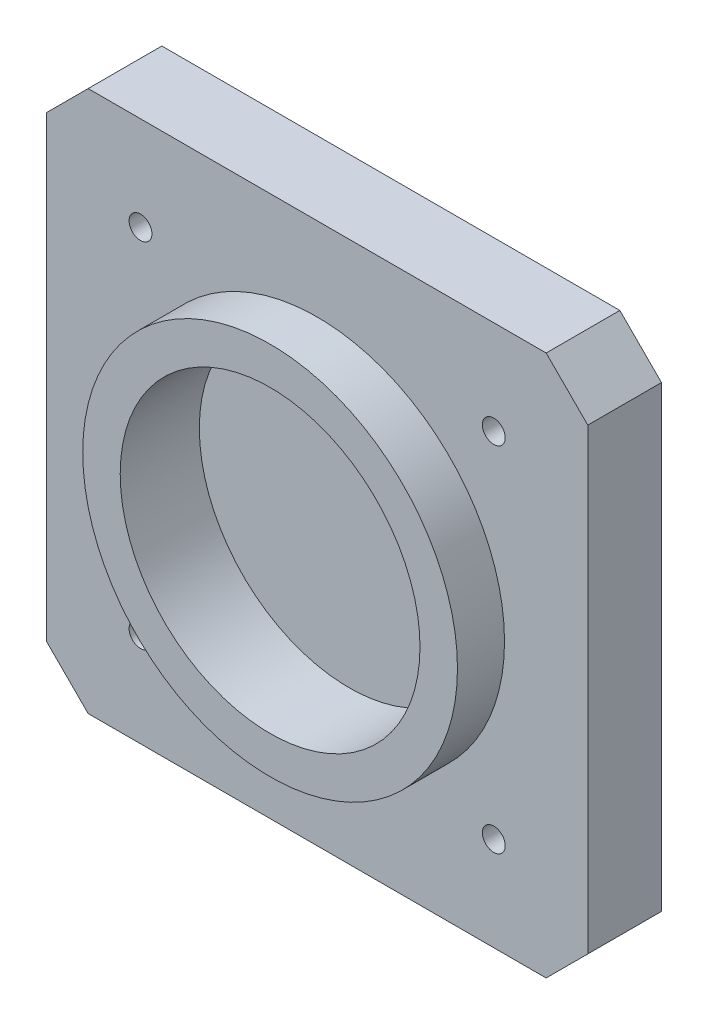
ISO-10303-21;
HEADER;
FILE_DESCRIPTION(('STEP AP214'),'2;1');
FILE_NAME('part.step','',(''),(''),'','','');
FILE_SCHEMA(('AUTOMOTIVE_DESIGN { 1 0 10303 214 1 1 1 1 }'));
ENDSEC;
DATA;
#1=APPLICATION_CONTEXT('core data for automotive mechanical design processes');
#2=APPLICATION_PROTOCOL_DEFINITION('international standard','automotive_design',2000,#1);
#3=PRODUCT_CONTEXT('',#1,'mechanical');
#4=PRODUCT('Part','Part','',(#3));
#5=PRODUCT_RELATED_PRODUCT_CATEGORY('part','',(#4));
#6=PRODUCT_DEFINITION_FORMATION('','',#4);
#7=PRODUCT_DEFINITION_CONTEXT('part definition',#1,'design');
#8=PRODUCT_DEFINITION('design','',#6,#7);
#9=PRODUCT_DEFINITION_SHAPE('','',#8);
#10=(LENGTH_UNIT() NAMED_UNIT(*) SI_UNIT(.MILLI.,.METRE.));
#11=(NAMED_UNIT(*) PLANE_ANGLE_UNIT() SI_UNIT($,.RADIAN.));
#12=(NAMED_UNIT(*) SI_UNIT($,.STERADIAN.) SOLID_ANGLE_UNIT());
#13=UNCERTAINTY_MEASURE_WITH_UNIT(LENGTH_MEASURE(1.E-05),#10,'distance_accuracy_value','');
#14=(GEOMETRIC_REPRESENTATION_CONTEXT(3) GLOBAL_UNCERTAINTY_ASSIGNED_CONTEXT((#13)) GLOBAL_UNIT_ASSIGNED_CONTEXT((#10,
#11,#12)) REPRESENTATION_CONTEXT('',''));
#15=CARTESIAN_POINT('',(0.,0.,0.));
#16=DIRECTION('',(0.,0.,1.));
#17=DIRECTION('',(1.,0.,0.));
#18=AXIS2_PLACEMENT_3D('',#15,#16,#17);
#19=CARTESIAN_POINT('',(0.,0.,-10.));
#20=DIRECTION('',(0.,0.,1.));
#21=DIRECTION('',(1.,0.,0.));
#22=AXIS2_PLACEMENT_3D('',#19,#20,#21);
#23=PLANE('',#22);
#24=CARTESIAN_POINT('',(-42.4264068711929,42.4264068711928,-10.));
#25=DIRECTION('',(0.,0.,-1.));
#26=DIRECTION('',(-1.,0.,0.));
#27=AXIS2_PLACEMENT_3D('',#24,#25,#26);
#28=CIRCLE('',#27,5.);
#29=CARTESIAN_POINT('',(-47.4264068711929,42.4264068711928,-10.));
#30=VERTEX_POINT('',#29);
#31=EDGE_CURVE('E509',#30,#30,#28,.T.);
#32=ORIENTED_EDGE('',*,*,#31,.F.);
#33=EDGE_LOOP('',(#32));
#34=FACE_BOUND('',#33,.T.);
#35=CARTESIAN_POINT('',(42.4264068711928,42.4264068711952,-10.));
#36=DIRECTION('',(0.,0.,-1.));
#37=DIRECTION('',(-1.,0.,0.));
#38=AXIS2_PLACEMENT_3D('',#35,#36,#37);
#39=CIRCLE('',#38,5.);
#40=CARTESIAN_POINT('',(37.4264068711928,42.4264068711952,-10.));
#41=VERTEX_POINT('',#40);
#42=EDGE_CURVE('E206',#41,#41,#39,.T.);
#43=ORIENTED_EDGE('',*,*,#42,.F.);
#44=EDGE_LOOP('',(#43));
#45=FACE_BOUND('',#44,.T.);
#46=CARTESIAN_POINT('',(-42.4264068711905,-42.4264068711929,-10.));
#47=DIRECTION('',(0.,0.,-1.));
#48=DIRECTION('',(-1.,0.,0.));
#49=AXIS2_PLACEMENT_3D('',#46,#47,#48);
#50=CIRCLE('',#49,5.);
#51=CARTESIAN_POINT('',(-47.4264068711905,-42.4264068711929,-10.));
#52=VERTEX_POINT('',#51);
#53=EDGE_CURVE('E193',#52,#52,#50,.T.);
#54=ORIENTED_EDGE('',*,*,#53,.F.);
#55=EDGE_LOOP('',(#54));
#56=FACE_BOUND('',#55,.T.);
#57=DIRECTION('',(-1.,0.,0.));
#58=VECTOR('',#57,1.);
#59=CARTESIAN_POINT('',(0.,-65.,-10.));
#60=LINE('',#59,#58);
#61=CARTESIAN_POINT('',(55.,-65.,-10.));
#62=VERTEX_POINT('',#61);
#63=CARTESIAN_POINT('',(-54.9999999999999,-65.,-10.));
#64=VERTEX_POINT('',#63);
#65=EDGE_CURVE('E173',#62,#64,#60,.T.);
#66=ORIENTED_EDGE('',*,*,#65,.T.);
#67=DIRECTION('',(-0.707106781186551,0.707106781186544,0.));
#68=VECTOR('',#67,1.);
#69=CARTESIAN_POINT('',(-65.,-55.,-10.));
#70=LINE('',#69,#68);
#71=CARTESIAN_POINT('',(-65.,-55.,-10.));
#72=VERTEX_POINT('',#71);
#73=EDGE_CURVE('E151',#64,#72,#70,.T.);
#74=ORIENTED_EDGE('',*,*,#73,.T.);
#75=DIRECTION('',(0.,-1.,0.));
#76=VECTOR('',#75,1.);
#77=CARTESIAN_POINT('',(-65.,0.,-10.));
#78=LINE('',#77,#76);
#79=CARTESIAN_POINT('',(-65.,55.,-10.));
#80=VERTEX_POINT('',#79);
#81=EDGE_CURVE('E167',#80,#72,#78,.T.);
#82=ORIENTED_EDGE('',*,*,#81,.F.);
#83=DIRECTION('',(-0.707106781186545,-0.70710678118655,0.));
#84=VECTOR('',#83,1.);
#85=CARTESIAN_POINT('',(-55.0000000000001,65.,-10.));
#86=LINE('',#85,#84);
#87=CARTESIAN_POINT('',(-55.0000000000001,65.,-10.));
#88=VERTEX_POINT('',#87);
#89=EDGE_CURVE('E127',#80,#88,#86,.F.);
#90=ORIENTED_EDGE('',*,*,#89,.T.);
#91=DIRECTION('',(-1.,0.,0.));
#92=VECTOR('',#91,1.);
#93=CARTESIAN_POINT('',(0.,65.,-10.));
#94=LINE('',#93,#92);
#95=CARTESIAN_POINT('',(55.,65.,-10.));
#96=VERTEX_POINT('',#95);
#97=EDGE_CURVE('E164',#96,#88,#94,.T.);
#98=ORIENTED_EDGE('',*,*,#97,.F.);
#99=DIRECTION('',(0.70710678118655,-0.707106781186545,0.));
#100=VECTOR('',#99,1.);
#101=CARTESIAN_POINT('',(65.,55.,-10.));
#102=LINE('',#101,#100);
#103=CARTESIAN_POINT('',(65.,55.,-10.));
#104=VERTEX_POINT('',#103);
#105=EDGE_CURVE('E57',#96,#104,#102,.T.);
#106=ORIENTED_EDGE('',*,*,#105,.T.);
#107=DIRECTION('',(0.,-1.,0.));
#108=VECTOR('',#107,1.);
#109=CARTESIAN_POINT('',(65.,0.,-10.));
#110=LINE('',#109,#108);
#111=CARTESIAN_POINT('',(65.,-54.9999999999999,-10.));
#112=VERTEX_POINT('',#111);
#113=EDGE_CURVE('E161',#104,#112,#110,.T.);
#114=ORIENTED_EDGE('',*,*,#113,.T.);
#115=DIRECTION('',(0.707106781186544,0.707106781186551,0.));
#116=VECTOR('',#115,1.);
#117=CARTESIAN_POINT('',(55.,-65.,-10.));
#118=LINE('',#117,#116);
#119=EDGE_CURVE('E148',#112,#62,#118,.F.);
#120=ORIENTED_EDGE('',*,*,#119,.T.);
#121=EDGE_LOOP('',(#66,#74,#82,#90,#98,#106,#114,#120));
#122=FACE_BOUND('',#121,.T.);
#123=CARTESIAN_POINT('',(42.4264068711952,-42.4264068711905,-10.));
#124=DIRECTION('',(0.,0.,-1.));
#125=DIRECTION('',(-1.,0.,0.));
#126=AXIS2_PLACEMENT_3D('',#123,#124,#125);
#127=CIRCLE('',#126,5.);
#128=CARTESIAN_POINT('',(37.4264068711952,-42.4264068711905,-10.));
#129=VERTEX_POINT('',#128);
#130=EDGE_CURVE('E189',#129,#129,#127,.T.);
#131=ORIENTED_EDGE('',*,*,#130,.F.);
#132=EDGE_LOOP('',(#131));
#133=FACE_BOUND('',#132,.T.);
#134=ADVANCED_FACE('F37',(#34,#45,#56,#122,#133),#23,.F.);
#135=CARTESIAN_POINT('',(0.,0.,19.));
#136=DIRECTION('',(0.,0.,-1.));
#137=DIRECTION('',(-1.,0.,0.));
#138=AXIS2_PLACEMENT_3D('',#135,#136,#137);
#139=CYLINDRICAL_SURFACE('',#138,36.);
#140=CARTESIAN_POINT('',(0.,0.,19.));
#141=DIRECTION('',(0.,0.,1.));
#142=DIRECTION('',(1.,0.,0.));
#143=AXIS2_PLACEMENT_3D('',#140,#141,#142);
#144=CIRCLE('',#143,36.);
#145=CARTESIAN_POINT('',(36.,0.,19.));
#146=VERTEX_POINT('',#145);
#147=EDGE_CURVE('E133',#146,#146,#144,.T.);
#148=ORIENTED_EDGE('',*,*,#147,.T.);
#149=EDGE_LOOP('',(#148));
#150=FACE_BOUND('',#149,.T.);
#151=CARTESIAN_POINT('',(0.,0.,0.));
#152=DIRECTION('',(0.,0.,1.));
#153=DIRECTION('',(1.,0.,0.));
#154=AXIS2_PLACEMENT_3D('',#151,#152,#153);
#155=CIRCLE('',#154,36.);
#156=CARTESIAN_POINT('',(36.,0.,0.));
#157=VERTEX_POINT('',#156);
#158=EDGE_CURVE('E177',#157,#157,#155,.T.);
#159=ORIENTED_EDGE('',*,*,#158,.F.);
#160=EDGE_LOOP('',(#159));
#161=FACE_BOUND('',#160,.T.);
#162=ADVANCED_FACE('F247',(#150,#161),#139,.F.);
#163=CARTESIAN_POINT('',(0.,0.,19.));
#164=DIRECTION('',(0.,0.,-1.));
#165=DIRECTION('',(-1.,0.,0.));
#166=AXIS2_PLACEMENT_3D('',#163,#164,#165);
#167=CYLINDRICAL_SURFACE('',#166,45.);
#168=CARTESIAN_POINT('',(0.,0.,7.7));
#169=DIRECTION('',(0.,0.,1.));
#170=DIRECTION('',(1.,0.,0.));
#171=AXIS2_PLACEMENT_3D('',#168,#169,#170);
#172=CIRCLE('',#171,45.);
#173=CARTESIAN_POINT('',(45.,0.,7.7));
#174=VERTEX_POINT('',#173);
#175=EDGE_CURVE('E185',#174,#174,#172,.T.);
#176=ORIENTED_EDGE('',*,*,#175,.T.);
#177=EDGE_LOOP('',(#176));
#178=FACE_BOUND('',#177,.T.);
#179=CARTESIAN_POINT('',(0.,0.,19.));
#180=DIRECTION('',(0.,0.,1.));
#181=DIRECTION('',(1.,0.,0.));
#182=AXIS2_PLACEMENT_3D('',#179,#180,#181);
#183=CIRCLE('',#182,45.);
#184=CARTESIAN_POINT('',(45.,0.,19.));
#185=VERTEX_POINT('',#184);
#186=EDGE_CURVE('E128',#185,#185,#183,.T.);
#187=ORIENTED_EDGE('',*,*,#186,.F.);
#188=EDGE_LOOP('',(#187));
#189=FACE_BOUND('',#188,.T.);
#190=ADVANCED_FACE('F225',(#178,#189),#167,.T.);
#191=CARTESIAN_POINT('',(0.,0.,19.));
#192=DIRECTION('',(0.,0.,1.));
#193=DIRECTION('',(1.,0.,0.));
#194=AXIS2_PLACEMENT_3D('',#191,#192,#193);
#195=PLANE('',#194);
#196=ORIENTED_EDGE('',*,*,#147,.F.);
#197=EDGE_LOOP('',(#196));
#198=FACE_BOUND('',#197,.T.);
#199=ORIENTED_EDGE('',*,*,#186,.T.);
#200=EDGE_LOOP('',(#199));
#201=FACE_BOUND('',#200,.T.);
#202=ADVANCED_FACE('F240',(#198,#201),#195,.T.);
#203=CARTESIAN_POINT('',(0.,0.,0.));
#204=DIRECTION('',(0.,0.,1.));
#205=DIRECTION('',(1.,0.,0.));
#206=AXIS2_PLACEMENT_3D('',#203,#204,#205);
#207=PLANE('',#206);
#208=ORIENTED_EDGE('',*,*,#158,.T.);
#209=EDGE_LOOP('',(#208));
#210=FACE_BOUND('',#209,.T.);
#211=ADVANCED_FACE('F230',(#210),#207,.T.);
#212=CARTESIAN_POINT('',(0.,0.,7.7));
#213=DIRECTION('',(0.,0.,1.));
#214=DIRECTION('',(1.,0.,0.));
#215=AXIS2_PLACEMENT_3D('',#212,#213,#214);
#216=PLANE('',#215);
#217=CARTESIAN_POINT('',(-42.4264068711929,42.4264068711928,7.7));
#218=DIRECTION('',(0.,0.,1.));
#219=DIRECTION('',(1.,0.,0.));
#220=AXIS2_PLACEMENT_3D('',#217,#218,#219);
#221=CIRCLE('',#220,2.75);
#222=CARTESIAN_POINT('',(-39.6764068711929,42.4264068711928,7.7));
#223=VERTEX_POINT('',#222);
#224=EDGE_CURVE('E136',#223,#223,#221,.T.);
#225=ORIENTED_EDGE('',*,*,#224,.F.);
#226=EDGE_LOOP('',(#225));
#227=FACE_BOUND('',#226,.T.);
#228=CARTESIAN_POINT('',(42.4264068711928,42.4264068711952,7.7));
#229=DIRECTION('',(0.,0.,1.));
#230=DIRECTION('',(1.,0.,0.));
#231=AXIS2_PLACEMENT_3D('',#228,#229,#230);
#232=CIRCLE('',#231,2.75);
#233=CARTESIAN_POINT('',(45.1764068711928,42.4264068711952,7.7));
#234=VERTEX_POINT('',#233);
#235=EDGE_CURVE('E191',#234,#234,#232,.T.);
#236=ORIENTED_EDGE('',*,*,#235,.F.);
#237=EDGE_LOOP('',(#236));
#238=FACE_BOUND('',#237,.T.);
#239=CARTESIAN_POINT('',(-42.4264068711905,-42.4264068711929,7.7));
#240=DIRECTION('',(0.,0.,1.));
#241=DIRECTION('',(1.,0.,0.));
#242=AXIS2_PLACEMENT_3D('',#239,#240,#241);
#243=CIRCLE('',#242,2.75);
#244=CARTESIAN_POINT('',(-39.6764068711905,-42.4264068711929,7.7));
#245=VERTEX_POINT('',#244);
#246=EDGE_CURVE('E187',#245,#245,#243,.T.);
#247=ORIENTED_EDGE('',*,*,#246,.F.);
#248=EDGE_LOOP('',(#247));
#249=FACE_BOUND('',#248,.T.);
#250=CARTESIAN_POINT('',(42.4264068711952,-42.4264068711905,7.7));
#251=DIRECTION('',(0.,0.,1.));
#252=DIRECTION('',(1.,0.,0.));
#253=AXIS2_PLACEMENT_3D('',#250,#251,#252);
#254=CIRCLE('',#253,2.75);
#255=CARTESIAN_POINT('',(45.1764068711952,-42.4264068711905,7.7));
#256=VERTEX_POINT('',#255);
#257=EDGE_CURVE('E182',#256,#256,#254,.T.);
#258=ORIENTED_EDGE('',*,*,#257,.F.);
#259=EDGE_LOOP('',(#258));
#260=FACE_BOUND('',#259,.T.);
#261=ORIENTED_EDGE('',*,*,#175,.F.);
#262=EDGE_LOOP('',(#261));
#263=FACE_BOUND('',#262,.T.);
#264=DIRECTION('',(0.,-1.,0.));
#265=VECTOR('',#264,1.);
#266=CARTESIAN_POINT('',(-65.,0.,7.7));
#267=LINE('',#266,#265);
#268=CARTESIAN_POINT('',(-65.,55.,7.7));
#269=VERTEX_POINT('',#268);
#270=CARTESIAN_POINT('',(-65.,-55.,7.7));
#271=VERTEX_POINT('',#270);
#272=EDGE_CURVE('E105',#269,#271,#267,.T.);
#273=ORIENTED_EDGE('',*,*,#272,.T.);
#274=DIRECTION('',(0.707106781186551,-0.707106781186544,0.));
#275=VECTOR('',#274,1.);
#276=CARTESIAN_POINT('',(-59.9999999999997,-60.0000000000003,7.7));
#277=LINE('',#276,#275);
#278=CARTESIAN_POINT('',(-54.9999999999999,-65.,7.7));
#279=VERTEX_POINT('',#278);
#280=EDGE_CURVE('E112',#271,#279,#277,.T.);
#281=ORIENTED_EDGE('',*,*,#280,.T.);
#282=DIRECTION('',(-1.,0.,0.));
#283=VECTOR('',#282,1.);
#284=CARTESIAN_POINT('',(0.,-65.,7.7));
#285=LINE('',#284,#283);
#286=CARTESIAN_POINT('',(55.,-65.,7.7));
#287=VERTEX_POINT('',#286);
#288=EDGE_CURVE('E123',#287,#279,#285,.T.);
#289=ORIENTED_EDGE('',*,*,#288,.F.);
#290=DIRECTION('',(-0.707106781186544,-0.707106781186551,0.));
#291=VECTOR('',#290,1.);
#292=CARTESIAN_POINT('',(60.0000000000003,-59.9999999999997,7.7));
#293=LINE('',#292,#291);
#294=CARTESIAN_POINT('',(65.,-54.9999999999999,7.7));
#295=VERTEX_POINT('',#294);
#296=EDGE_CURVE('E113',#287,#295,#293,.F.);
#297=ORIENTED_EDGE('',*,*,#296,.T.);
#298=DIRECTION('',(0.,-1.,0.));
#299=VECTOR('',#298,1.);
#300=CARTESIAN_POINT('',(65.,0.,7.7));
#301=LINE('',#300,#299);
#302=CARTESIAN_POINT('',(65.,55.,7.7));
#303=VERTEX_POINT('',#302);
#304=EDGE_CURVE('E160',#303,#295,#301,.T.);
#305=ORIENTED_EDGE('',*,*,#304,.F.);
#306=DIRECTION('',(-0.70710678118655,0.707106781186545,0.));
#307=VECTOR('',#306,1.);
#308=CARTESIAN_POINT('',(59.9999999999998,60.0000000000002,7.7));
#309=LINE('',#308,#307);
#310=CARTESIAN_POINT('',(55.,65.,7.7));
#311=VERTEX_POINT('',#310);
#312=EDGE_CURVE('E130',#303,#311,#309,.T.);
#313=ORIENTED_EDGE('',*,*,#312,.T.);
#314=DIRECTION('',(-1.,0.,0.));
#315=VECTOR('',#314,1.);
#316=CARTESIAN_POINT('',(0.,65.,7.7));
#317=LINE('',#316,#315);
#318=CARTESIAN_POINT('',(-55.0000000000001,65.,7.7));
#319=VERTEX_POINT('',#318);
#320=EDGE_CURVE('E107',#311,#319,#317,.T.);
#321=ORIENTED_EDGE('',*,*,#320,.T.);
#322=DIRECTION('',(0.707106781186545,0.70710678118655,0.));
#323=VECTOR('',#322,1.);
#324=CARTESIAN_POINT('',(-60.0000000000002,59.9999999999998,7.7));
#325=LINE('',#324,#323);
#326=EDGE_CURVE('E102',#319,#269,#325,.F.);
#327=ORIENTED_EDGE('',*,*,#326,.T.);
#328=EDGE_LOOP('',(#273,#281,#289,#297,#305,#313,#321,#327));
#329=FACE_BOUND('',#328,.T.);
#330=ADVANCED_FACE('F104',(#227,#238,#249,#260,#263,#329),#216,.T.);
#331=CARTESIAN_POINT('',(0.,65.,-10.));
#332=DIRECTION('',(0.,1.,0.));
#333=DIRECTION('',(-1.,0.,0.));
#334=AXIS2_PLACEMENT_3D('',#331,#332,#333);
#335=PLANE('',#334);
#336=ORIENTED_EDGE('',*,*,#97,.T.);
#337=DIRECTION('',(0.,0.,1.));
#338=VECTOR('',#337,1.);
#339=CARTESIAN_POINT('',(-55.0000000000001,65.,-10.));
#340=LINE('',#339,#338);
#341=EDGE_CURVE('E155',#88,#319,#340,.T.);
#342=ORIENTED_EDGE('',*,*,#341,.T.);
#343=ORIENTED_EDGE('',*,*,#320,.F.);
#344=DIRECTION('',(0.,0.,-1.));
#345=VECTOR('',#344,1.);
#346=CARTESIAN_POINT('',(55.,65.,-10.));
#347=LINE('',#346,#345);
#348=EDGE_CURVE('E153',#311,#96,#347,.T.);
#349=ORIENTED_EDGE('',*,*,#348,.T.);
#350=EDGE_LOOP('',(#336,#342,#343,#349));
#351=FACE_BOUND('',#350,.T.);
#352=ADVANCED_FACE('F229',(#351),#335,.T.);
#353=CARTESIAN_POINT('',(65.,0.,-10.));
#354=DIRECTION('',(-1.,0.,0.));
#355=DIRECTION('',(0.,-1.,0.));
#356=AXIS2_PLACEMENT_3D('',#353,#354,#355);
#357=PLANE('',#356);
#358=ORIENTED_EDGE('',*,*,#304,.T.);
#359=DIRECTION('',(0.,0.,-1.));
#360=VECTOR('',#359,1.);
#361=CARTESIAN_POINT('',(65.,-54.9999999999999,-10.));
#362=LINE('',#361,#360);
#363=EDGE_CURVE('E11',#295,#112,#362,.T.);
#364=ORIENTED_EDGE('',*,*,#363,.T.);
#365=ORIENTED_EDGE('',*,*,#113,.F.);
#366=DIRECTION('',(0.,0.,1.));
#367=VECTOR('',#366,1.);
#368=CARTESIAN_POINT('',(65.,55.,7.7));
#369=LINE('',#368,#367);
#370=EDGE_CURVE('E45',#104,#303,#369,.T.);
#371=ORIENTED_EDGE('',*,*,#370,.T.);
#372=EDGE_LOOP('',(#358,#364,#365,#371));
#373=FACE_BOUND('',#372,.T.);
#374=ADVANCED_FACE('F159',(#373),#357,.F.);
#375=CARTESIAN_POINT('',(0.,-65.,-10.));
#376=DIRECTION('',(0.,1.,0.));
#377=DIRECTION('',(-1.,0.,0.));
#378=AXIS2_PLACEMENT_3D('',#375,#376,#377);
#379=PLANE('',#378);
#380=ORIENTED_EDGE('',*,*,#288,.T.);
#381=DIRECTION('',(0.,0.,-1.));
#382=VECTOR('',#381,1.);
#383=CARTESIAN_POINT('',(-54.9999999999999,-65.,-10.));
#384=LINE('',#383,#382);
#385=EDGE_CURVE('E145',#279,#64,#384,.T.);
#386=ORIENTED_EDGE('',*,*,#385,.T.);
#387=ORIENTED_EDGE('',*,*,#65,.F.);
#388=DIRECTION('',(0.,0.,1.));
#389=VECTOR('',#388,1.);
#390=CARTESIAN_POINT('',(55.,-65.,-10.));
#391=LINE('',#390,#389);
#392=EDGE_CURVE('E142',#62,#287,#391,.T.);
#393=ORIENTED_EDGE('',*,*,#392,.T.);
#394=EDGE_LOOP('',(#380,#386,#387,#393));
#395=FACE_BOUND('',#394,.T.);
#396=ADVANCED_FACE('F260',(#395),#379,.F.);
#397=CARTESIAN_POINT('',(-65.,0.,-10.));
#398=DIRECTION('',(-1.,0.,0.));
#399=DIRECTION('',(0.,-1.,0.));
#400=AXIS2_PLACEMENT_3D('',#397,#398,#399);
#401=PLANE('',#400);
#402=ORIENTED_EDGE('',*,*,#81,.T.);
#403=DIRECTION('',(0.,0.,1.));
#404=VECTOR('',#403,1.);
#405=CARTESIAN_POINT('',(-65.,-55.,7.7));
#406=LINE('',#405,#404);
#407=EDGE_CURVE('E122',#72,#271,#406,.T.);
#408=ORIENTED_EDGE('',*,*,#407,.T.);
#409=ORIENTED_EDGE('',*,*,#272,.F.);
#410=DIRECTION('',(0.,0.,-1.));
#411=VECTOR('',#410,1.);
#412=CARTESIAN_POINT('',(-65.,55.,-10.));
#413=LINE('',#412,#411);
#414=EDGE_CURVE('E119',#269,#80,#413,.T.);
#415=ORIENTED_EDGE('',*,*,#414,.T.);
#416=EDGE_LOOP('',(#402,#408,#409,#415));
#417=FACE_BOUND('',#416,.T.);
#418=ADVANCED_FACE('F118',(#417),#401,.T.);
#419=CARTESIAN_POINT('',(42.4264068711952,-42.4264068711905,-10.));
#420=DIRECTION('',(0.,0.,-1.));
#421=DIRECTION('',(-1.,0.,0.));
#422=AXIS2_PLACEMENT_3D('',#419,#420,#421);
#423=CYLINDRICAL_SURFACE('',#422,2.75);
#424=ORIENTED_EDGE('',*,*,#257,.T.);
#425=EDGE_LOOP('',(#424));
#426=FACE_BOUND('',#425,.T.);
#427=CARTESIAN_POINT('',(42.4264068711952,-42.4264068711905,-4.3));
#428=DIRECTION('',(0.,0.,-1.));
#429=DIRECTION('',(-1.,0.,0.));
#430=AXIS2_PLACEMENT_3D('',#427,#428,#429);
#431=CIRCLE('',#430,2.75);
#432=CARTESIAN_POINT('',(39.6764068711952,-42.4264068711905,-4.3));
#433=VERTEX_POINT('',#432);
#434=EDGE_CURVE('E186',#433,#433,#431,.T.);
#435=ORIENTED_EDGE('',*,*,#434,.T.);
#436=EDGE_LOOP('',(#435));
#437=FACE_BOUND('',#436,.T.);
#438=ADVANCED_FACE('F265',(#426,#437),#423,.F.);
#439=CARTESIAN_POINT('',(45.1764068711952,-42.4264068711905,-4.3));
#440=DIRECTION('',(0.,0.,1.));
#441=DIRECTION('',(1.,0.,0.));
#442=AXIS2_PLACEMENT_3D('',#439,#440,#441);
#443=PLANE('',#442);
#444=ORIENTED_EDGE('',*,*,#434,.F.);
#445=EDGE_LOOP('',(#444));
#446=FACE_BOUND('',#445,.T.);
#447=CARTESIAN_POINT('',(42.4264068711952,-42.4264068711905,-4.3));
#448=DIRECTION('',(0.,0.,-1.));
#449=DIRECTION('',(-1.,0.,0.));
#450=AXIS2_PLACEMENT_3D('',#447,#448,#449);
#451=CIRCLE('',#450,5.);
#452=CARTESIAN_POINT('',(37.4264068711952,-42.4264068711905,-4.3));
#453=VERTEX_POINT('',#452);
#454=EDGE_CURVE('E216',#453,#453,#451,.T.);
#455=ORIENTED_EDGE('',*,*,#454,.T.);
#456=EDGE_LOOP('',(#455));
#457=FACE_BOUND('',#456,.T.);
#458=ADVANCED_FACE('F296',(#446,#457),#443,.F.);
#459=CARTESIAN_POINT('',(42.4264068711952,-42.4264068711905,-10.));
#460=DIRECTION('',(0.,0.,-1.));
#461=DIRECTION('',(-1.,0.,0.));
#462=AXIS2_PLACEMENT_3D('',#459,#460,#461);
#463=CYLINDRICAL_SURFACE('',#462,5.);
#464=ORIENTED_EDGE('',*,*,#454,.F.);
#465=EDGE_LOOP('',(#464));
#466=FACE_BOUND('',#465,.T.);
#467=ORIENTED_EDGE('',*,*,#130,.T.);
#468=EDGE_LOOP('',(#467));
#469=FACE_BOUND('',#468,.T.);
#470=ADVANCED_FACE('F293',(#466,#469),#463,.F.);
#471=CARTESIAN_POINT('',(-42.4264068711905,-42.4264068711929,-10.));
#472=DIRECTION('',(0.,0.,-1.));
#473=DIRECTION('',(-1.,0.,0.));
#474=AXIS2_PLACEMENT_3D('',#471,#472,#473);
#475=CYLINDRICAL_SURFACE('',#474,2.75);
#476=ORIENTED_EDGE('',*,*,#246,.T.);
#477=EDGE_LOOP('',(#476));
#478=FACE_BOUND('',#477,.T.);
#479=CARTESIAN_POINT('',(-42.4264068711905,-42.4264068711929,-4.3));
#480=DIRECTION('',(0.,0.,-1.));
#481=DIRECTION('',(-1.,0.,0.));
#482=AXIS2_PLACEMENT_3D('',#479,#480,#481);
#483=CIRCLE('',#482,2.75);
#484=CARTESIAN_POINT('',(-45.1764068711905,-42.4264068711929,-4.3));
#485=VERTEX_POINT('',#484);
#486=EDGE_CURVE('E190',#485,#485,#483,.T.);
#487=ORIENTED_EDGE('',*,*,#486,.T.);
#488=EDGE_LOOP('',(#487));
#489=FACE_BOUND('',#488,.T.);
#490=ADVANCED_FACE('F295',(#478,#489),#475,.F.);
#491=CARTESIAN_POINT('',(-39.6764068711905,-42.4264068711929,-4.3));
#492=DIRECTION('',(0.,0.,1.));
#493=DIRECTION('',(1.,0.,0.));
#494=AXIS2_PLACEMENT_3D('',#491,#492,#493);
#495=PLANE('',#494);
#496=ORIENTED_EDGE('',*,*,#486,.F.);
#497=EDGE_LOOP('',(#496));
#498=FACE_BOUND('',#497,.T.);
#499=CARTESIAN_POINT('',(-42.4264068711905,-42.4264068711929,-4.3));
#500=DIRECTION('',(0.,0.,-1.));
#501=DIRECTION('',(-1.,0.,0.));
#502=AXIS2_PLACEMENT_3D('',#499,#500,#501);
#503=CIRCLE('',#502,5.);
#504=CARTESIAN_POINT('',(-47.4264068711905,-42.4264068711929,-4.3));
#505=VERTEX_POINT('',#504);
#506=EDGE_CURVE('E198',#505,#505,#503,.T.);
#507=ORIENTED_EDGE('',*,*,#506,.T.);
#508=EDGE_LOOP('',(#507));
#509=FACE_BOUND('',#508,.T.);
#510=ADVANCED_FACE('F303',(#498,#509),#495,.F.);
#511=CARTESIAN_POINT('',(-42.4264068711905,-42.4264068711929,-10.));
#512=DIRECTION('',(0.,0.,-1.));
#513=DIRECTION('',(-1.,0.,0.));
#514=AXIS2_PLACEMENT_3D('',#511,#512,#513);
#515=CYLINDRICAL_SURFACE('',#514,5.);
#516=ORIENTED_EDGE('',*,*,#506,.F.);
#517=EDGE_LOOP('',(#516));
#518=FACE_BOUND('',#517,.T.);
#519=ORIENTED_EDGE('',*,*,#53,.T.);
#520=EDGE_LOOP('',(#519));
#521=FACE_BOUND('',#520,.T.);
#522=ADVANCED_FACE('F346',(#518,#521),#515,.F.);
#523=CARTESIAN_POINT('',(42.4264068711928,42.4264068711952,-10.));
#524=DIRECTION('',(0.,0.,-1.));
#525=DIRECTION('',(-1.,0.,0.));
#526=AXIS2_PLACEMENT_3D('',#523,#524,#525);
#527=CYLINDRICAL_SURFACE('',#526,2.75);
#528=ORIENTED_EDGE('',*,*,#235,.T.);
#529=EDGE_LOOP('',(#528));
#530=FACE_BOUND('',#529,.T.);
#531=CARTESIAN_POINT('',(42.4264068711928,42.4264068711952,-4.3));
#532=DIRECTION('',(0.,0.,-1.));
#533=DIRECTION('',(-1.,0.,0.));
#534=AXIS2_PLACEMENT_3D('',#531,#532,#533);
#535=CIRCLE('',#534,2.75);
#536=CARTESIAN_POINT('',(39.6764068711928,42.4264068711952,-4.3));
#537=VERTEX_POINT('',#536);
#538=EDGE_CURVE('E194',#537,#537,#535,.T.);
#539=ORIENTED_EDGE('',*,*,#538,.T.);
#540=EDGE_LOOP('',(#539));
#541=FACE_BOUND('',#540,.T.);
#542=ADVANCED_FACE('F355',(#530,#541),#527,.F.);
#543=CARTESIAN_POINT('',(45.1764068711928,42.4264068711952,-4.3));
#544=DIRECTION('',(0.,0.,1.));
#545=DIRECTION('',(1.,0.,0.));
#546=AXIS2_PLACEMENT_3D('',#543,#544,#545);
#547=PLANE('',#546);
#548=ORIENTED_EDGE('',*,*,#538,.F.);
#549=EDGE_LOOP('',(#548));
#550=FACE_BOUND('',#549,.T.);
#551=CARTESIAN_POINT('',(42.4264068711928,42.4264068711952,-4.3));
#552=DIRECTION('',(0.,0.,-1.));
#553=DIRECTION('',(-1.,0.,0.));
#554=AXIS2_PLACEMENT_3D('',#551,#552,#553);
#555=CIRCLE('',#554,5.);
#556=CARTESIAN_POINT('',(37.4264068711928,42.4264068711952,-4.3));
#557=VERTEX_POINT('',#556);
#558=EDGE_CURVE('E201',#557,#557,#555,.T.);
#559=ORIENTED_EDGE('',*,*,#558,.T.);
#560=EDGE_LOOP('',(#559));
#561=FACE_BOUND('',#560,.T.);
#562=ADVANCED_FACE('F365',(#550,#561),#547,.F.);
#563=CARTESIAN_POINT('',(42.4264068711928,42.4264068711952,-10.));
#564=DIRECTION('',(0.,0.,-1.));
#565=DIRECTION('',(-1.,0.,0.));
#566=AXIS2_PLACEMENT_3D('',#563,#564,#565);
#567=CYLINDRICAL_SURFACE('',#566,5.);
#568=ORIENTED_EDGE('',*,*,#558,.F.);
#569=EDGE_LOOP('',(#568));
#570=FACE_BOUND('',#569,.T.);
#571=ORIENTED_EDGE('',*,*,#42,.T.);
#572=EDGE_LOOP('',(#571));
#573=FACE_BOUND('',#572,.T.);
#574=ADVANCED_FACE('F374',(#570,#573),#567,.F.);
#575=CARTESIAN_POINT('',(-42.4264068711929,42.4264068711928,-10.));
#576=DIRECTION('',(0.,0.,-1.));
#577=DIRECTION('',(-1.,0.,0.));
#578=AXIS2_PLACEMENT_3D('',#575,#576,#577);
#579=CYLINDRICAL_SURFACE('',#578,2.75);
#580=ORIENTED_EDGE('',*,*,#224,.T.);
#581=EDGE_LOOP('',(#580));
#582=FACE_BOUND('',#581,.T.);
#583=CARTESIAN_POINT('',(-42.4264068711929,42.4264068711928,-4.3));
#584=DIRECTION('',(0.,0.,-1.));
#585=DIRECTION('',(-1.,0.,0.));
#586=AXIS2_PLACEMENT_3D('',#583,#584,#585);
#587=CIRCLE('',#586,2.75);
#588=CARTESIAN_POINT('',(-45.1764068711929,42.4264068711928,-4.3));
#589=VERTEX_POINT('',#588);
#590=EDGE_CURVE('E511',#589,#589,#587,.T.);
#591=ORIENTED_EDGE('',*,*,#590,.T.);
#592=EDGE_LOOP('',(#591));
#593=FACE_BOUND('',#592,.T.);
#594=ADVANCED_FACE('F384',(#582,#593),#579,.F.);
#595=CARTESIAN_POINT('',(-39.6764068711929,42.4264068711928,-4.3));
#596=DIRECTION('',(0.,0.,1.));
#597=DIRECTION('',(1.,0.,0.));
#598=AXIS2_PLACEMENT_3D('',#595,#596,#597);
#599=PLANE('',#598);
#600=ORIENTED_EDGE('',*,*,#590,.F.);
#601=EDGE_LOOP('',(#600));
#602=FACE_BOUND('',#601,.T.);
#603=CARTESIAN_POINT('',(-42.4264068711929,42.4264068711928,-4.3));
#604=DIRECTION('',(0.,0.,-1.));
#605=DIRECTION('',(-1.,0.,0.));
#606=AXIS2_PLACEMENT_3D('',#603,#604,#605);
#607=CIRCLE('',#606,5.);
#608=CARTESIAN_POINT('',(-47.4264068711929,42.4264068711928,-4.3));
#609=VERTEX_POINT('',#608);
#610=EDGE_CURVE('E507',#609,#609,#607,.T.);
#611=ORIENTED_EDGE('',*,*,#610,.T.);
#612=EDGE_LOOP('',(#611));
#613=FACE_BOUND('',#612,.T.);
#614=ADVANCED_FACE('F394',(#602,#613),#599,.F.);
#615=CARTESIAN_POINT('',(-42.4264068711929,42.4264068711928,-10.));
#616=DIRECTION('',(0.,0.,-1.));
#617=DIRECTION('',(-1.,0.,0.));
#618=AXIS2_PLACEMENT_3D('',#615,#616,#617);
#619=CYLINDRICAL_SURFACE('',#618,5.);
#620=ORIENTED_EDGE('',*,*,#610,.F.);
#621=EDGE_LOOP('',(#620));
#622=FACE_BOUND('',#621,.T.);
#623=ORIENTED_EDGE('',*,*,#31,.T.);
#624=EDGE_LOOP('',(#623));
#625=FACE_BOUND('',#624,.T.);
#626=ADVANCED_FACE('F275',(#622,#625),#619,.F.);
#627=CARTESIAN_POINT('',(-65.,-55.,-10.));
#628=DIRECTION('',(-0.707106781186544,-0.707106781186551,0.));
#629=DIRECTION('',(0.,0.,-1.));
#630=AXIS2_PLACEMENT_3D('',#627,#628,#629);
#631=PLANE('',#630);
#632=ORIENTED_EDGE('',*,*,#73,.F.);
#633=ORIENTED_EDGE('',*,*,#385,.F.);
#634=ORIENTED_EDGE('',*,*,#280,.F.);
#635=ORIENTED_EDGE('',*,*,#407,.F.);
#636=EDGE_LOOP('',(#632,#633,#634,#635));
#637=FACE_BOUND('',#636,.T.);
#638=ADVANCED_FACE('F272',(#637),#631,.T.);
#639=CARTESIAN_POINT('',(-55.0000000000001,65.,-10.));
#640=DIRECTION('',(0.70710678118655,-0.707106781186545,0.));
#641=DIRECTION('',(0.,0.,1.));
#642=AXIS2_PLACEMENT_3D('',#639,#640,#641);
#643=PLANE('',#642);
#644=ORIENTED_EDGE('',*,*,#89,.F.);
#645=ORIENTED_EDGE('',*,*,#414,.F.);
#646=ORIENTED_EDGE('',*,*,#326,.F.);
#647=ORIENTED_EDGE('',*,*,#341,.F.);
#648=EDGE_LOOP('',(#644,#645,#646,#647));
#649=FACE_BOUND('',#648,.T.);
#650=ADVANCED_FACE('F126',(#649),#643,.F.);
#651=CARTESIAN_POINT('',(55.,-65.,-10.));
#652=DIRECTION('',(-0.707106781186551,0.707106781186544,0.));
#653=DIRECTION('',(0.,0.,1.));
#654=AXIS2_PLACEMENT_3D('',#651,#652,#653);
#655=PLANE('',#654);
#656=ORIENTED_EDGE('',*,*,#119,.F.);
#657=ORIENTED_EDGE('',*,*,#363,.F.);
#658=ORIENTED_EDGE('',*,*,#296,.F.);
#659=ORIENTED_EDGE('',*,*,#392,.F.);
#660=EDGE_LOOP('',(#656,#657,#658,#659));
#661=FACE_BOUND('',#660,.T.);
#662=ADVANCED_FACE('F278',(#661),#655,.F.);
#663=CARTESIAN_POINT('',(65.,55.,-10.));
#664=DIRECTION('',(0.707106781186545,0.70710678118655,0.));
#665=DIRECTION('',(0.,0.,-1.));
#666=AXIS2_PLACEMENT_3D('',#663,#664,#665);
#667=PLANE('',#666);
#668=ORIENTED_EDGE('',*,*,#105,.F.);
#669=ORIENTED_EDGE('',*,*,#348,.F.);
#670=ORIENTED_EDGE('',*,*,#312,.F.);
#671=ORIENTED_EDGE('',*,*,#370,.F.);
#672=EDGE_LOOP('',(#668,#669,#670,#671));
#673=FACE_BOUND('',#672,.T.);
#674=ADVANCED_FACE('F39',(#673),#667,.T.);
#675=CLOSED_SHELL('',(#134,#162,#190,#202,#211,#330,#352,#374,#396,#418,#438,#458,#470,#490,
#510,#522,#542,#562,#574,#594,#614,#626,#638,#650,#662,#674));
#676=MANIFOLD_SOLID_BREP('B2',#675);
#677=ADVANCED_BREP_SHAPE_REPRESENTATION('',(#18,#676),#14);
#678=SHAPE_DEFINITION_REPRESENTATION(#9,#677);
ENDSEC;
END-ISO-10303-21;
